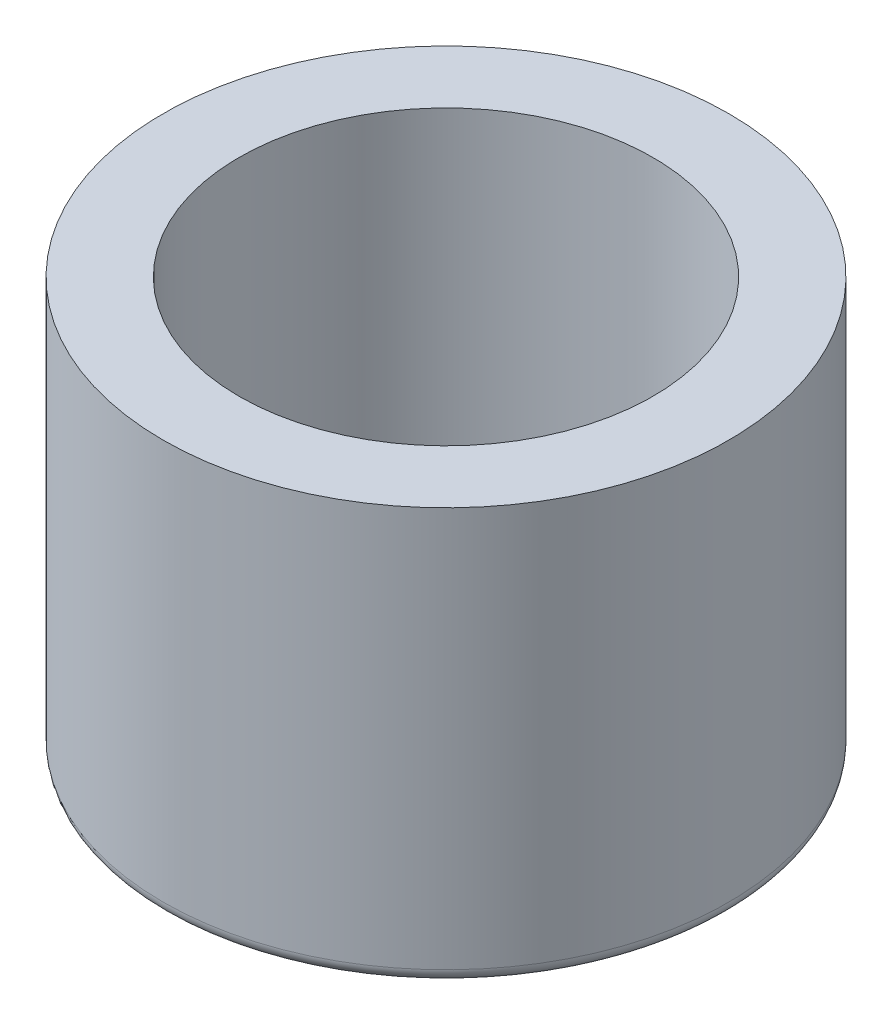
ISO-10303-21;
HEADER;
FILE_DESCRIPTION(('STEP AP214'),'2;1');
FILE_NAME('part.step','',(''),(''),'','','');
FILE_SCHEMA(('AUTOMOTIVE_DESIGN { 1 0 10303 214 1 1 1 1 }'));
ENDSEC;
DATA;
#1=APPLICATION_CONTEXT('core data for automotive mechanical design processes');
#2=APPLICATION_PROTOCOL_DEFINITION('international standard','automotive_design',2000,#1);
#3=PRODUCT_CONTEXT('',#1,'mechanical');
#4=PRODUCT('Part','Part','',(#3));
#5=PRODUCT_RELATED_PRODUCT_CATEGORY('part','',(#4));
#6=PRODUCT_DEFINITION_FORMATION('','',#4);
#7=PRODUCT_DEFINITION_CONTEXT('part definition',#1,'design');
#8=PRODUCT_DEFINITION('design','',#6,#7);
#9=PRODUCT_DEFINITION_SHAPE('','',#8);
#10=(LENGTH_UNIT() NAMED_UNIT(*) SI_UNIT(.MILLI.,.METRE.));
#11=(NAMED_UNIT(*) PLANE_ANGLE_UNIT() SI_UNIT($,.RADIAN.));
#12=(NAMED_UNIT(*) SI_UNIT($,.STERADIAN.) SOLID_ANGLE_UNIT());
#13=UNCERTAINTY_MEASURE_WITH_UNIT(LENGTH_MEASURE(1.E-05),#10,'distance_accuracy_value','');
#14=(GEOMETRIC_REPRESENTATION_CONTEXT(3) GLOBAL_UNCERTAINTY_ASSIGNED_CONTEXT((#13)) GLOBAL_UNIT_ASSIGNED_CONTEXT((#10,
#11,#12)) REPRESENTATION_CONTEXT('',''));
#15=CARTESIAN_POINT('',(0.,0.,0.));
#16=DIRECTION('',(0.,0.,1.));
#17=DIRECTION('',(1.,0.,0.));
#18=AXIS2_PLACEMENT_3D('',#15,#16,#17);
#19=CARTESIAN_POINT('',(0.,15.,0.));
#20=DIRECTION('',(0.,-1.,0.));
#21=DIRECTION('',(0.,0.,-1.));
#22=AXIS2_PLACEMENT_3D('',#19,#20,#21);
#23=CYLINDRICAL_SURFACE('',#22,10.25);
#24=CARTESIAN_POINT('',(0.,0.5,0.));
#25=DIRECTION('',(0.,1.,0.));
#26=DIRECTION('',(0.,0.,1.));
#27=AXIS2_PLACEMENT_3D('',#24,#25,#26);
#28=CIRCLE('',#27,10.25);
#29=CARTESIAN_POINT('',(0.,0.5,10.25));
#30=VERTEX_POINT('',#29);
#31=EDGE_CURVE('E38',#30,#30,#28,.T.);
#32=ORIENTED_EDGE('',*,*,#31,.T.);
#33=EDGE_LOOP('',(#32));
#34=FACE_BOUND('',#33,.T.);
#35=CARTESIAN_POINT('',(0.,15.,0.));
#36=DIRECTION('',(0.,1.,0.));
#37=DIRECTION('',(0.,0.,1.));
#38=AXIS2_PLACEMENT_3D('',#35,#36,#37);
#39=CIRCLE('',#38,10.25);
#40=CARTESIAN_POINT('',(0.,15.,10.25));
#41=VERTEX_POINT('',#40);
#42=EDGE_CURVE('E42',#41,#41,#39,.T.);
#43=ORIENTED_EDGE('',*,*,#42,.F.);
#44=EDGE_LOOP('',(#43));
#45=FACE_BOUND('',#44,.T.);
#46=ADVANCED_FACE('F31',(#34,#45),#23,.T.);
#47=CARTESIAN_POINT('',(0.,15.,0.));
#48=DIRECTION('',(0.,1.,0.));
#49=DIRECTION('',(0.,0.,1.));
#50=AXIS2_PLACEMENT_3D('',#47,#48,#49);
#51=PLANE('',#50);
#52=CARTESIAN_POINT('',(0.,15.,0.));
#53=DIRECTION('',(0.,1.,0.));
#54=DIRECTION('',(0.,0.,1.));
#55=AXIS2_PLACEMENT_3D('',#52,#53,#54);
#56=CIRCLE('',#55,7.5);
#57=CARTESIAN_POINT('',(0.,15.,7.5));
#58=VERTEX_POINT('',#57);
#59=EDGE_CURVE('E51',#58,#58,#56,.T.);
#60=ORIENTED_EDGE('',*,*,#59,.F.);
#61=EDGE_LOOP('',(#60));
#62=FACE_BOUND('',#61,.T.);
#63=ORIENTED_EDGE('',*,*,#42,.T.);
#64=EDGE_LOOP('',(#63));
#65=FACE_BOUND('',#64,.T.);
#66=ADVANCED_FACE('F57',(#62,#65),#51,.T.);
#67=CARTESIAN_POINT('',(0.,0.,0.));
#68=DIRECTION('',(0.,1.,0.));
#69=DIRECTION('',(0.,0.,1.));
#70=AXIS2_PLACEMENT_3D('',#67,#68,#69);
#71=PLANE('',#70);
#72=CARTESIAN_POINT('',(0.,0.,0.));
#73=DIRECTION('',(0.,1.,0.));
#74=DIRECTION('',(0.,0.,1.));
#75=AXIS2_PLACEMENT_3D('',#72,#73,#74);
#76=CIRCLE('',#75,9.75);
#77=CARTESIAN_POINT('',(0.,0.,9.75));
#78=VERTEX_POINT('',#77);
#79=EDGE_CURVE('E10',#78,#78,#76,.F.);
#80=ORIENTED_EDGE('',*,*,#79,.T.);
#81=EDGE_LOOP('',(#80));
#82=FACE_BOUND('',#81,.T.);
#83=CARTESIAN_POINT('',(0.,0.,0.));
#84=DIRECTION('',(0.,1.,0.));
#85=DIRECTION('',(0.,0.,1.));
#86=AXIS2_PLACEMENT_3D('',#83,#84,#85);
#87=CIRCLE('',#86,7.5);
#88=CARTESIAN_POINT('',(0.,0.,7.5));
#89=VERTEX_POINT('',#88);
#90=EDGE_CURVE('E46',#89,#89,#87,.F.);
#91=ORIENTED_EDGE('',*,*,#90,.F.);
#92=EDGE_LOOP('',(#91));
#93=FACE_BOUND('',#92,.T.);
#94=ADVANCED_FACE('F60',(#82,#93),#71,.F.);
#95=CARTESIAN_POINT('',(0.,-21.2132034355964,0.));
#96=DIRECTION('',(0.,1.,0.));
#97=DIRECTION('',(0.,0.,1.));
#98=AXIS2_PLACEMENT_3D('',#95,#96,#97);
#99=CYLINDRICAL_SURFACE('',#98,7.5);
#100=ORIENTED_EDGE('',*,*,#90,.T.);
#101=EDGE_LOOP('',(#100));
#102=FACE_BOUND('',#101,.T.);
#103=ORIENTED_EDGE('',*,*,#59,.T.);
#104=EDGE_LOOP('',(#103));
#105=FACE_BOUND('',#104,.T.);
#106=ADVANCED_FACE('F55',(#102,#105),#99,.F.);
#107=CARTESIAN_POINT('',(0.,0.5,0.));
#108=DIRECTION('',(0.,1.,0.));
#109=DIRECTION('',(0.,0.,1.));
#110=AXIS2_PLACEMENT_3D('',#107,#108,#109);
#111=TOROIDAL_SURFACE('',#110,9.75,0.5);
#112=ORIENTED_EDGE('',*,*,#79,.F.);
#113=EDGE_LOOP('',(#112));
#114=FACE_BOUND('',#113,.T.);
#115=ORIENTED_EDGE('',*,*,#31,.F.);
#116=EDGE_LOOP('',(#115));
#117=FACE_BOUND('',#116,.T.);
#118=ADVANCED_FACE('F33',(#114,#117),#111,.T.);
#119=CLOSED_SHELL('',(#46,#66,#94,#106,#118));
#120=MANIFOLD_SOLID_BREP('B2',#119);
#121=ADVANCED_BREP_SHAPE_REPRESENTATION('',(#18,#120),#14);
#122=SHAPE_DEFINITION_REPRESENTATION(#9,#121);
ENDSEC;
END-ISO-10303-21;
